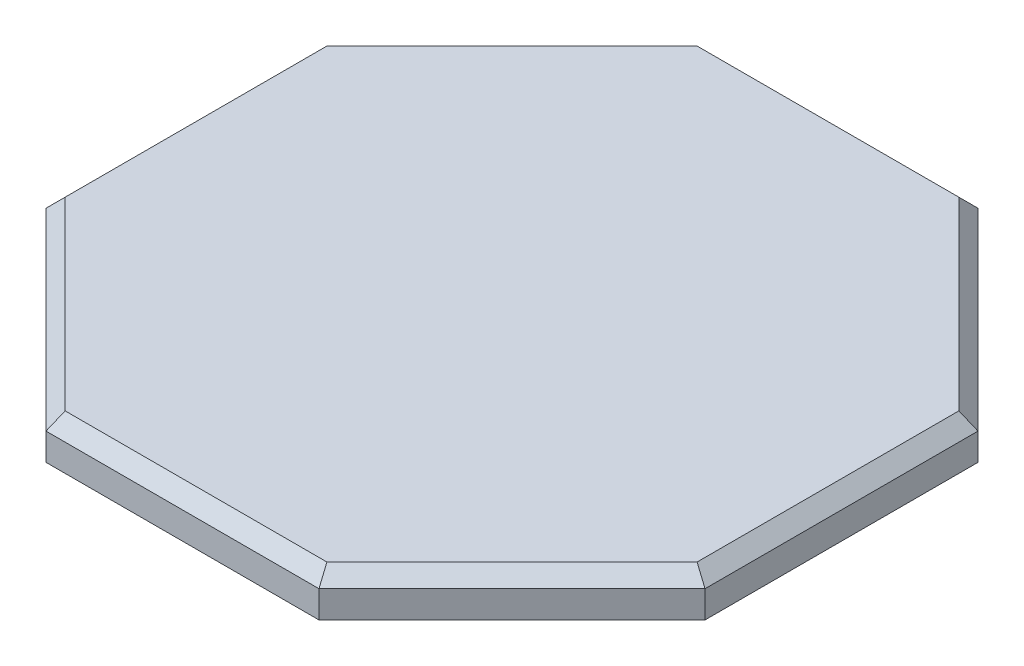
ISO-10303-21;
HEADER;
FILE_DESCRIPTION(('STEP AP214'),'2;1');
FILE_NAME('part.step','',(''),(''),'','','');
FILE_SCHEMA(('AUTOMOTIVE_DESIGN { 1 0 10303 214 1 1 1 1 }'));
ENDSEC;
DATA;
#1=APPLICATION_CONTEXT('core data for automotive mechanical design processes');
#2=APPLICATION_PROTOCOL_DEFINITION('international standard','automotive_design',2000,#1);
#3=PRODUCT_CONTEXT('',#1,'mechanical');
#4=PRODUCT('Part','Part','',(#3));
#5=PRODUCT_RELATED_PRODUCT_CATEGORY('part','',(#4));
#6=PRODUCT_DEFINITION_FORMATION('','',#4);
#7=PRODUCT_DEFINITION_CONTEXT('part definition',#1,'design');
#8=PRODUCT_DEFINITION('design','',#6,#7);
#9=PRODUCT_DEFINITION_SHAPE('','',#8);
#10=(LENGTH_UNIT() NAMED_UNIT(*) SI_UNIT(.MILLI.,.METRE.));
#11=(NAMED_UNIT(*) PLANE_ANGLE_UNIT() SI_UNIT($,.RADIAN.));
#12=(NAMED_UNIT(*) SI_UNIT($,.STERADIAN.) SOLID_ANGLE_UNIT());
#13=UNCERTAINTY_MEASURE_WITH_UNIT(LENGTH_MEASURE(1.E-05),#10,'distance_accuracy_value','');
#14=(GEOMETRIC_REPRESENTATION_CONTEXT(3) GLOBAL_UNCERTAINTY_ASSIGNED_CONTEXT((#13)) GLOBAL_UNIT_ASSIGNED_CONTEXT((#10,
#11,#12)) REPRESENTATION_CONTEXT('',''));
#15=CARTESIAN_POINT('',(0.,0.,0.));
#16=DIRECTION('',(0.,0.,1.));
#17=DIRECTION('',(1.,0.,0.));
#18=AXIS2_PLACEMENT_3D('',#15,#16,#17);
#19=CARTESIAN_POINT('',(-30.2375900532359,9.,73.));
#20=DIRECTION('',(0.,0.,-1.));
#21=DIRECTION('',(-1.,0.,0.));
#22=AXIS2_PLACEMENT_3D('',#19,#20,#21);
#23=PLANE('',#22);
#24=DIRECTION('',(0.,-1.,0.));
#25=VECTOR('',#24,1.);
#26=CARTESIAN_POINT('',(30.2375900532359,9.,73.));
#27=LINE('',#26,#25);
#28=CARTESIAN_POINT('',(30.2375900532359,5.99999999999997,73.));
#29=VERTEX_POINT('',#28);
#30=CARTESIAN_POINT('',(30.2375900532359,0.,73.));
#31=VERTEX_POINT('',#30);
#32=EDGE_CURVE('E291',#29,#31,#27,.T.);
#33=ORIENTED_EDGE('',*,*,#32,.F.);
#34=DIRECTION('',(-1.,0.,0.));
#35=VECTOR('',#34,1.);
#36=CARTESIAN_POINT('',(-30.2375900532359,5.99999999999997,73.));
#37=LINE('',#36,#35);
#38=CARTESIAN_POINT('',(-30.2375900532359,5.99999999999997,73.));
#39=VERTEX_POINT('',#38);
#40=EDGE_CURVE('E11',#29,#39,#37,.T.);
#41=ORIENTED_EDGE('',*,*,#40,.T.);
#42=DIRECTION('',(0.,-1.,0.));
#43=VECTOR('',#42,1.);
#44=CARTESIAN_POINT('',(-30.2375900532359,9.,73.));
#45=LINE('',#44,#43);
#46=CARTESIAN_POINT('',(-30.2375900532359,0.,73.));
#47=VERTEX_POINT('',#46);
#48=EDGE_CURVE('E277',#39,#47,#45,.T.);
#49=ORIENTED_EDGE('',*,*,#48,.T.);
#50=DIRECTION('',(1.,0.,0.));
#51=VECTOR('',#50,1.);
#52=CARTESIAN_POINT('',(-30.2375900532359,0.,73.));
#53=LINE('',#52,#51);
#54=EDGE_CURVE('E207',#47,#31,#53,.T.);
#55=ORIENTED_EDGE('',*,*,#54,.T.);
#56=EDGE_LOOP('',(#33,#41,#49,#55));
#57=FACE_BOUND('',#56,.T.);
#58=ADVANCED_FACE('F43',(#57),#23,.F.);
#59=CARTESIAN_POINT('',(30.2375900532359,9.,73.));
#60=DIRECTION('',(-0.707106781186548,0.,-0.707106781186547));
#61=DIRECTION('',(-0.707106781186547,0.,0.707106781186548));
#62=AXIS2_PLACEMENT_3D('',#59,#60,#61);
#63=PLANE('',#62);
#64=DIRECTION('',(0.,-1.,0.));
#65=VECTOR('',#64,1.);
#66=CARTESIAN_POINT('',(73.,9.,30.2375900532359));
#67=LINE('',#66,#65);
#68=CARTESIAN_POINT('',(73.,5.99999999999997,30.2375900532359));
#69=VERTEX_POINT('',#68);
#70=CARTESIAN_POINT('',(73.,0.,30.2375900532359));
#71=VERTEX_POINT('',#70);
#72=EDGE_CURVE('E289',#69,#71,#67,.T.);
#73=ORIENTED_EDGE('',*,*,#72,.F.);
#74=DIRECTION('',(-0.707106781186547,0.,0.707106781186548));
#75=VECTOR('',#74,1.);
#76=CARTESIAN_POINT('',(30.2375900532359,5.99999999999997,73.));
#77=LINE('',#76,#75);
#78=EDGE_CURVE('E53',#69,#29,#77,.T.);
#79=ORIENTED_EDGE('',*,*,#78,.T.);
#80=ORIENTED_EDGE('',*,*,#32,.T.);
#81=DIRECTION('',(0.707106781186547,0.,-0.707106781186548));
#82=VECTOR('',#81,1.);
#83=CARTESIAN_POINT('',(30.2375900532359,0.,73.));
#84=LINE('',#83,#82);
#85=EDGE_CURVE('E211',#31,#71,#84,.T.);
#86=ORIENTED_EDGE('',*,*,#85,.T.);
#87=EDGE_LOOP('',(#73,#79,#80,#86));
#88=FACE_BOUND('',#87,.T.);
#89=ADVANCED_FACE('F414',(#88),#63,.F.);
#90=CARTESIAN_POINT('',(73.,9.,30.2375900532359));
#91=DIRECTION('',(-1.,0.,0.));
#92=DIRECTION('',(0.,0.,1.));
#93=AXIS2_PLACEMENT_3D('',#90,#91,#92);
#94=PLANE('',#93);
#95=DIRECTION('',(0.,-1.,0.));
#96=VECTOR('',#95,1.);
#97=CARTESIAN_POINT('',(73.,9.,-30.2375900532359));
#98=LINE('',#97,#96);
#99=CARTESIAN_POINT('',(73.,5.99999999999997,-30.2375900532359));
#100=VERTEX_POINT('',#99);
#101=CARTESIAN_POINT('',(73.,0.,-30.2375900532359));
#102=VERTEX_POINT('',#101);
#103=EDGE_CURVE('E287',#100,#102,#98,.T.);
#104=ORIENTED_EDGE('',*,*,#103,.F.);
#105=DIRECTION('',(0.,0.,1.));
#106=VECTOR('',#105,1.);
#107=CARTESIAN_POINT('',(73.,5.99999999999997,30.2375900532359));
#108=LINE('',#107,#106);
#109=EDGE_CURVE('E68',#100,#69,#108,.T.);
#110=ORIENTED_EDGE('',*,*,#109,.T.);
#111=ORIENTED_EDGE('',*,*,#72,.T.);
#112=DIRECTION('',(0.,0.,-1.));
#113=VECTOR('',#112,1.);
#114=CARTESIAN_POINT('',(73.,0.,30.2375900532359));
#115=LINE('',#114,#113);
#116=EDGE_CURVE('E259',#71,#102,#115,.T.);
#117=ORIENTED_EDGE('',*,*,#116,.T.);
#118=EDGE_LOOP('',(#104,#110,#111,#117));
#119=FACE_BOUND('',#118,.T.);
#120=ADVANCED_FACE('F356',(#119),#94,.F.);
#121=CARTESIAN_POINT('',(73.,9.,-30.2375900532359));
#122=DIRECTION('',(-0.707106781186548,0.,0.707106781186547));
#123=DIRECTION('',(0.707106781186547,0.,0.707106781186548));
#124=AXIS2_PLACEMENT_3D('',#121,#122,#123);
#125=PLANE('',#124);
#126=DIRECTION('',(0.,-1.,0.));
#127=VECTOR('',#126,1.);
#128=CARTESIAN_POINT('',(30.2375900532359,9.,-73.));
#129=LINE('',#128,#127);
#130=CARTESIAN_POINT('',(30.2375900532359,5.99999999999997,-73.));
#131=VERTEX_POINT('',#130);
#132=CARTESIAN_POINT('',(30.2375900532359,0.,-73.));
#133=VERTEX_POINT('',#132);
#134=EDGE_CURVE('E285',#131,#133,#129,.T.);
#135=ORIENTED_EDGE('',*,*,#134,.F.);
#136=DIRECTION('',(0.707106781186547,0.,0.707106781186548));
#137=VECTOR('',#136,1.);
#138=CARTESIAN_POINT('',(73.,5.99999999999997,-30.2375900532359));
#139=LINE('',#138,#137);
#140=EDGE_CURVE('E319',#131,#100,#139,.T.);
#141=ORIENTED_EDGE('',*,*,#140,.T.);
#142=ORIENTED_EDGE('',*,*,#103,.T.);
#143=DIRECTION('',(-0.707106781186547,0.,-0.707106781186548));
#144=VECTOR('',#143,1.);
#145=CARTESIAN_POINT('',(73.,0.,-30.2375900532359));
#146=LINE('',#145,#144);
#147=EDGE_CURVE('E262',#102,#133,#146,.T.);
#148=ORIENTED_EDGE('',*,*,#147,.T.);
#149=EDGE_LOOP('',(#135,#141,#142,#148));
#150=FACE_BOUND('',#149,.T.);
#151=ADVANCED_FACE('F355',(#150),#125,.F.);
#152=CARTESIAN_POINT('',(30.2375900532359,9.,-73.));
#153=DIRECTION('',(0.,0.,1.));
#154=DIRECTION('',(1.,0.,0.));
#155=AXIS2_PLACEMENT_3D('',#152,#153,#154);
#156=PLANE('',#155);
#157=DIRECTION('',(0.,-1.,0.));
#158=VECTOR('',#157,1.);
#159=CARTESIAN_POINT('',(-30.2375900532359,9.,-73.));
#160=LINE('',#159,#158);
#161=CARTESIAN_POINT('',(-30.2375900532359,5.99999999999997,-73.));
#162=VERTEX_POINT('',#161);
#163=CARTESIAN_POINT('',(-30.2375900532359,0.,-73.));
#164=VERTEX_POINT('',#163);
#165=EDGE_CURVE('E283',#162,#164,#160,.T.);
#166=ORIENTED_EDGE('',*,*,#165,.F.);
#167=DIRECTION('',(1.,0.,0.));
#168=VECTOR('',#167,1.);
#169=CARTESIAN_POINT('',(30.2375900532359,5.99999999999997,-73.));
#170=LINE('',#169,#168);
#171=EDGE_CURVE('E317',#162,#131,#170,.T.);
#172=ORIENTED_EDGE('',*,*,#171,.T.);
#173=ORIENTED_EDGE('',*,*,#134,.T.);
#174=DIRECTION('',(-1.,0.,0.));
#175=VECTOR('',#174,1.);
#176=CARTESIAN_POINT('',(30.2375900532359,0.,-73.));
#177=LINE('',#176,#175);
#178=EDGE_CURVE('E265',#133,#164,#177,.T.);
#179=ORIENTED_EDGE('',*,*,#178,.T.);
#180=EDGE_LOOP('',(#166,#172,#173,#179));
#181=FACE_BOUND('',#180,.T.);
#182=ADVANCED_FACE('F368',(#181),#156,.F.);
#183=CARTESIAN_POINT('',(-30.2375900532359,9.,-73.));
#184=DIRECTION('',(0.707106781186547,0.,0.707106781186548));
#185=DIRECTION('',(0.707106781186548,0.,-0.707106781186547));
#186=AXIS2_PLACEMENT_3D('',#183,#184,#185);
#187=PLANE('',#186);
#188=DIRECTION('',(0.,-1.,0.));
#189=VECTOR('',#188,1.);
#190=CARTESIAN_POINT('',(-73.,9.,-30.237590053236));
#191=LINE('',#190,#189);
#192=CARTESIAN_POINT('',(-73.,5.99999999999997,-30.237590053236));
#193=VERTEX_POINT('',#192);
#194=CARTESIAN_POINT('',(-73.,0.,-30.237590053236));
#195=VERTEX_POINT('',#194);
#196=EDGE_CURVE('E281',#193,#195,#191,.T.);
#197=ORIENTED_EDGE('',*,*,#196,.F.);
#198=DIRECTION('',(0.707106781186548,0.,-0.707106781186547));
#199=VECTOR('',#198,1.);
#200=CARTESIAN_POINT('',(-30.2375900532359,5.99999999999997,-73.));
#201=LINE('',#200,#199);
#202=EDGE_CURVE('E315',#193,#162,#201,.T.);
#203=ORIENTED_EDGE('',*,*,#202,.T.);
#204=ORIENTED_EDGE('',*,*,#165,.T.);
#205=DIRECTION('',(-0.707106781186548,0.,0.707106781186547));
#206=VECTOR('',#205,1.);
#207=CARTESIAN_POINT('',(-30.2375900532359,0.,-73.));
#208=LINE('',#207,#206);
#209=EDGE_CURVE('E268',#164,#195,#208,.T.);
#210=ORIENTED_EDGE('',*,*,#209,.T.);
#211=EDGE_LOOP('',(#197,#203,#204,#210));
#212=FACE_BOUND('',#211,.T.);
#213=ADVANCED_FACE('F371',(#212),#187,.F.);
#214=CARTESIAN_POINT('',(-73.,9.,-30.237590053236));
#215=DIRECTION('',(1.,0.,0.));
#216=DIRECTION('',(0.,0.,-1.));
#217=AXIS2_PLACEMENT_3D('',#214,#215,#216);
#218=PLANE('',#217);
#219=DIRECTION('',(0.,-1.,0.));
#220=VECTOR('',#219,1.);
#221=CARTESIAN_POINT('',(-73.,9.,30.2375900532359));
#222=LINE('',#221,#220);
#223=CARTESIAN_POINT('',(-73.,5.99999999999997,30.2375900532359));
#224=VERTEX_POINT('',#223);
#225=CARTESIAN_POINT('',(-73.,0.,30.2375900532359));
#226=VERTEX_POINT('',#225);
#227=EDGE_CURVE('E279',#224,#226,#222,.T.);
#228=ORIENTED_EDGE('',*,*,#227,.F.);
#229=DIRECTION('',(0.,0.,-1.));
#230=VECTOR('',#229,1.);
#231=CARTESIAN_POINT('',(-73.,5.99999999999997,-30.237590053236));
#232=LINE('',#231,#230);
#233=EDGE_CURVE('E313',#224,#193,#232,.T.);
#234=ORIENTED_EDGE('',*,*,#233,.T.);
#235=ORIENTED_EDGE('',*,*,#196,.T.);
#236=DIRECTION('',(0.,0.,1.));
#237=VECTOR('',#236,1.);
#238=CARTESIAN_POINT('',(-73.,0.,-30.237590053236));
#239=LINE('',#238,#237);
#240=EDGE_CURVE('E271',#195,#226,#239,.T.);
#241=ORIENTED_EDGE('',*,*,#240,.T.);
#242=EDGE_LOOP('',(#228,#234,#235,#241));
#243=FACE_BOUND('',#242,.T.);
#244=ADVANCED_FACE('F428',(#243),#218,.F.);
#245=CARTESIAN_POINT('',(-73.,9.,30.2375900532359));
#246=DIRECTION('',(0.707106781186548,0.,-0.707106781186547));
#247=DIRECTION('',(-0.707106781186547,0.,-0.707106781186548));
#248=AXIS2_PLACEMENT_3D('',#245,#246,#247);
#249=PLANE('',#248);
#250=ORIENTED_EDGE('',*,*,#48,.F.);
#251=DIRECTION('',(-0.707106781186547,0.,-0.707106781186548));
#252=VECTOR('',#251,1.);
#253=CARTESIAN_POINT('',(-73.,5.99999999999997,30.2375900532359));
#254=LINE('',#253,#252);
#255=EDGE_CURVE('E310',#39,#224,#254,.T.);
#256=ORIENTED_EDGE('',*,*,#255,.T.);
#257=ORIENTED_EDGE('',*,*,#227,.T.);
#258=DIRECTION('',(0.707106781186547,0.,0.707106781186548));
#259=VECTOR('',#258,1.);
#260=CARTESIAN_POINT('',(-73.,0.,30.2375900532359));
#261=LINE('',#260,#259);
#262=EDGE_CURVE('E274',#226,#47,#261,.T.);
#263=ORIENTED_EDGE('',*,*,#262,.T.);
#264=EDGE_LOOP('',(#250,#256,#257,#263));
#265=FACE_BOUND('',#264,.T.);
#266=ADVANCED_FACE('F400',(#265),#249,.F.);
#267=CARTESIAN_POINT('',(0.,9.,0.));
#268=DIRECTION('',(0.,1.,0.));
#269=DIRECTION('',(0.,0.,1.));
#270=AXIS2_PLACEMENT_3D('',#267,#268,#269);
#271=PLANE('',#270);
#272=DIRECTION('',(0.,0.,1.));
#273=VECTOR('',#272,1.);
#274=CARTESIAN_POINT('',(-70.,9.,30.2375900532359));
#275=LINE('',#274,#273);
#276=CARTESIAN_POINT('',(-70.,9.,-28.9949493661167));
#277=VERTEX_POINT('',#276);
#278=CARTESIAN_POINT('',(-70.,9.,28.9949493661166));
#279=VERTEX_POINT('',#278);
#280=EDGE_CURVE('E305',#277,#279,#275,.T.);
#281=ORIENTED_EDGE('',*,*,#280,.T.);
#282=DIRECTION('',(0.707106781186547,0.,0.707106781186548));
#283=VECTOR('',#282,1.);
#284=CARTESIAN_POINT('',(-28.1162697096763,9.,70.8786796564404));
#285=LINE('',#284,#283);
#286=CARTESIAN_POINT('',(-28.9949493661166,9.,70.));
#287=VERTEX_POINT('',#286);
#288=EDGE_CURVE('E307',#279,#287,#285,.T.);
#289=ORIENTED_EDGE('',*,*,#288,.T.);
#290=DIRECTION('',(1.,0.,0.));
#291=VECTOR('',#290,1.);
#292=CARTESIAN_POINT('',(30.2375900532359,9.,70.));
#293=LINE('',#292,#291);
#294=CARTESIAN_POINT('',(28.9949493661166,9.,70.));
#295=VERTEX_POINT('',#294);
#296=EDGE_CURVE('E293',#287,#295,#293,.T.);
#297=ORIENTED_EDGE('',*,*,#296,.T.);
#298=DIRECTION('',(0.707106781186547,0.,-0.707106781186548));
#299=VECTOR('',#298,1.);
#300=CARTESIAN_POINT('',(70.8786796564404,9.,28.1162697096763));
#301=LINE('',#300,#299);
#302=CARTESIAN_POINT('',(70.,9.,28.9949493661166));
#303=VERTEX_POINT('',#302);
#304=EDGE_CURVE('E295',#295,#303,#301,.T.);
#305=ORIENTED_EDGE('',*,*,#304,.T.);
#306=DIRECTION('',(0.,0.,-1.));
#307=VECTOR('',#306,1.);
#308=CARTESIAN_POINT('',(70.,9.,-30.2375900532359));
#309=LINE('',#308,#307);
#310=CARTESIAN_POINT('',(70.,9.,-28.9949493661166));
#311=VERTEX_POINT('',#310);
#312=EDGE_CURVE('E297',#303,#311,#309,.T.);
#313=ORIENTED_EDGE('',*,*,#312,.T.);
#314=DIRECTION('',(-0.707106781186547,0.,-0.707106781186548));
#315=VECTOR('',#314,1.);
#316=CARTESIAN_POINT('',(28.1162697096763,9.,-70.8786796564404));
#317=LINE('',#316,#315);
#318=CARTESIAN_POINT('',(28.9949493661166,9.,-70.));
#319=VERTEX_POINT('',#318);
#320=EDGE_CURVE('E299',#311,#319,#317,.T.);
#321=ORIENTED_EDGE('',*,*,#320,.T.);
#322=DIRECTION('',(-1.,0.,0.));
#323=VECTOR('',#322,1.);
#324=CARTESIAN_POINT('',(-30.2375900532359,9.,-70.));
#325=LINE('',#324,#323);
#326=CARTESIAN_POINT('',(-28.9949493661166,9.,-70.));
#327=VERTEX_POINT('',#326);
#328=EDGE_CURVE('E301',#319,#327,#325,.T.);
#329=ORIENTED_EDGE('',*,*,#328,.T.);
#330=DIRECTION('',(-0.707106781186548,0.,0.707106781186547));
#331=VECTOR('',#330,1.);
#332=CARTESIAN_POINT('',(-70.8786796564403,9.,-28.1162697096763));
#333=LINE('',#332,#331);
#334=EDGE_CURVE('E303',#327,#277,#333,.T.);
#335=ORIENTED_EDGE('',*,*,#334,.T.);
#336=EDGE_LOOP('',(#281,#289,#297,#305,#313,#321,#329,#335));
#337=FACE_BOUND('',#336,.T.);
#338=ADVANCED_FACE('F384',(#337),#271,.T.);
#339=CARTESIAN_POINT('',(0.,0.,0.));
#340=DIRECTION('',(0.,1.,0.));
#341=DIRECTION('',(0.,0.,1.));
#342=AXIS2_PLACEMENT_3D('',#339,#340,#341);
#343=PLANE('',#342);
#344=DIRECTION('',(0.707106781186547,0.,0.707106781186548));
#345=VECTOR('',#344,1.);
#346=CARTESIAN_POINT('',(-70.8786796564403,0.,28.1162697096763));
#347=LINE('',#346,#345);
#348=CARTESIAN_POINT('',(-70.,0.,28.9949493661166));
#349=VERTEX_POINT('',#348);
#350=CARTESIAN_POINT('',(-28.9949493661167,0.,70.));
#351=VERTEX_POINT('',#350);
#352=EDGE_CURVE('E202',#349,#351,#347,.T.);
#353=ORIENTED_EDGE('',*,*,#352,.T.);
#354=DIRECTION('',(1.,0.,0.));
#355=VECTOR('',#354,1.);
#356=CARTESIAN_POINT('',(-30.2375900532359,0.,70.));
#357=LINE('',#356,#355);
#358=CARTESIAN_POINT('',(28.9949493661167,0.,70.));
#359=VERTEX_POINT('',#358);
#360=EDGE_CURVE('E237',#351,#359,#357,.T.);
#361=ORIENTED_EDGE('',*,*,#360,.T.);
#362=DIRECTION('',(0.707106781186547,0.,-0.707106781186548));
#363=VECTOR('',#362,1.);
#364=CARTESIAN_POINT('',(28.1162697096763,0.,70.8786796564404));
#365=LINE('',#364,#363);
#366=CARTESIAN_POINT('',(70.,0.,28.9949493661167));
#367=VERTEX_POINT('',#366);
#368=EDGE_CURVE('E206',#359,#367,#365,.T.);
#369=ORIENTED_EDGE('',*,*,#368,.T.);
#370=DIRECTION('',(0.,0.,-1.));
#371=VECTOR('',#370,1.);
#372=CARTESIAN_POINT('',(70.,0.,30.2375900532359));
#373=LINE('',#372,#371);
#374=CARTESIAN_POINT('',(70.,0.,-28.9949493661166));
#375=VERTEX_POINT('',#374);
#376=EDGE_CURVE('E253',#367,#375,#373,.T.);
#377=ORIENTED_EDGE('',*,*,#376,.T.);
#378=DIRECTION('',(-0.707106781186547,0.,-0.707106781186548));
#379=VECTOR('',#378,1.);
#380=CARTESIAN_POINT('',(70.8786796564403,0.,-28.1162697096763));
#381=LINE('',#380,#379);
#382=CARTESIAN_POINT('',(28.9949493661166,0.,-70.));
#383=VERTEX_POINT('',#382);
#384=EDGE_CURVE('E250',#375,#383,#381,.T.);
#385=ORIENTED_EDGE('',*,*,#384,.T.);
#386=DIRECTION('',(-1.,0.,0.));
#387=VECTOR('',#386,1.);
#388=CARTESIAN_POINT('',(30.2375900532359,0.,-70.));
#389=LINE('',#388,#387);
#390=CARTESIAN_POINT('',(-28.9949493661166,0.,-70.));
#391=VERTEX_POINT('',#390);
#392=EDGE_CURVE('E247',#383,#391,#389,.T.);
#393=ORIENTED_EDGE('',*,*,#392,.T.);
#394=DIRECTION('',(-0.707106781186548,0.,0.707106781186547));
#395=VECTOR('',#394,1.);
#396=CARTESIAN_POINT('',(-28.1162697096763,0.,-70.8786796564404));
#397=LINE('',#396,#395);
#398=CARTESIAN_POINT('',(-70.,0.,-28.9949493661167));
#399=VERTEX_POINT('',#398);
#400=EDGE_CURVE('E244',#391,#399,#397,.T.);
#401=ORIENTED_EDGE('',*,*,#400,.T.);
#402=DIRECTION('',(0.,0.,1.));
#403=VECTOR('',#402,1.);
#404=CARTESIAN_POINT('',(-70.,0.,-30.237590053236));
#405=LINE('',#404,#403);
#406=EDGE_CURVE('E241',#399,#349,#405,.T.);
#407=ORIENTED_EDGE('',*,*,#406,.T.);
#408=EDGE_LOOP('',(#353,#361,#369,#377,#385,#393,#401,#407));
#409=FACE_BOUND('',#408,.T.);
#410=ORIENTED_EDGE('',*,*,#54,.F.);
#411=ORIENTED_EDGE('',*,*,#262,.F.);
#412=ORIENTED_EDGE('',*,*,#240,.F.);
#413=ORIENTED_EDGE('',*,*,#209,.F.);
#414=ORIENTED_EDGE('',*,*,#178,.F.);
#415=ORIENTED_EDGE('',*,*,#147,.F.);
#416=ORIENTED_EDGE('',*,*,#116,.F.);
#417=ORIENTED_EDGE('',*,*,#85,.F.);
#418=EDGE_LOOP('',(#410,#411,#412,#413,#414,#415,#416,#417));
#419=FACE_BOUND('',#418,.T.);
#420=ADVANCED_FACE('F363',(#409,#419),#343,.F.);
#421=CARTESIAN_POINT('',(-30.2375900532359,9.,70.));
#422=DIRECTION('',(0.,0.,-1.));
#423=DIRECTION('',(-1.,0.,0.));
#424=AXIS2_PLACEMENT_3D('',#421,#422,#423);
#425=PLANE('',#424);
#426=ORIENTED_EDGE('',*,*,#360,.F.);
#427=DIRECTION('',(0.,-1.,0.));
#428=VECTOR('',#427,1.);
#429=CARTESIAN_POINT('',(-28.9949493661167,9.,70.));
#430=LINE('',#429,#428);
#431=CARTESIAN_POINT('',(-28.9949493661167,6.,70.));
#432=VERTEX_POINT('',#431);
#433=EDGE_CURVE('E201',#432,#351,#430,.T.);
#434=ORIENTED_EDGE('',*,*,#433,.F.);
#435=DIRECTION('',(1.,0.,0.));
#436=VECTOR('',#435,1.);
#437=CARTESIAN_POINT('',(-30.2375900532359,6.,70.));
#438=LINE('',#437,#436);
#439=CARTESIAN_POINT('',(28.9949493661167,6.,70.));
#440=VERTEX_POINT('',#439);
#441=EDGE_CURVE('E186',#432,#440,#438,.T.);
#442=ORIENTED_EDGE('',*,*,#441,.T.);
#443=DIRECTION('',(0.,-1.,0.));
#444=VECTOR('',#443,1.);
#445=CARTESIAN_POINT('',(28.9949493661167,9.,70.));
#446=LINE('',#445,#444);
#447=EDGE_CURVE('E199',#440,#359,#446,.T.);
#448=ORIENTED_EDGE('',*,*,#447,.T.);
#449=EDGE_LOOP('',(#426,#434,#442,#448));
#450=FACE_BOUND('',#449,.T.);
#451=ADVANCED_FACE('F198',(#450),#425,.T.);
#452=CARTESIAN_POINT('',(28.1162697096763,9.,70.8786796564404));
#453=DIRECTION('',(-0.707106781186548,0.,-0.707106781186547));
#454=DIRECTION('',(-0.707106781186547,0.,0.707106781186548));
#455=AXIS2_PLACEMENT_3D('',#452,#453,#454);
#456=PLANE('',#455);
#457=ORIENTED_EDGE('',*,*,#368,.F.);
#458=ORIENTED_EDGE('',*,*,#447,.F.);
#459=DIRECTION('',(0.707106781186547,0.,-0.707106781186548));
#460=VECTOR('',#459,1.);
#461=CARTESIAN_POINT('',(28.1162697096763,6.,70.8786796564404));
#462=LINE('',#461,#460);
#463=CARTESIAN_POINT('',(70.,6.,28.9949493661167));
#464=VERTEX_POINT('',#463);
#465=EDGE_CURVE('E182',#440,#464,#462,.T.);
#466=ORIENTED_EDGE('',*,*,#465,.T.);
#467=DIRECTION('',(0.,-1.,0.));
#468=VECTOR('',#467,1.);
#469=CARTESIAN_POINT('',(70.,9.,28.9949493661167));
#470=LINE('',#469,#468);
#471=EDGE_CURVE('E208',#464,#367,#470,.T.);
#472=ORIENTED_EDGE('',*,*,#471,.T.);
#473=EDGE_LOOP('',(#457,#458,#466,#472));
#474=FACE_BOUND('',#473,.T.);
#475=ADVANCED_FACE('F204',(#474),#456,.T.);
#476=CARTESIAN_POINT('',(70.,9.,30.2375900532359));
#477=DIRECTION('',(-1.,0.,0.));
#478=DIRECTION('',(0.,0.,1.));
#479=AXIS2_PLACEMENT_3D('',#476,#477,#478);
#480=PLANE('',#479);
#481=ORIENTED_EDGE('',*,*,#376,.F.);
#482=ORIENTED_EDGE('',*,*,#471,.F.);
#483=DIRECTION('',(0.,0.,-1.));
#484=VECTOR('',#483,1.);
#485=CARTESIAN_POINT('',(70.,6.,30.2375900532359));
#486=LINE('',#485,#484);
#487=CARTESIAN_POINT('',(70.,6.,-28.9949493661166));
#488=VERTEX_POINT('',#487);
#489=EDGE_CURVE('E188',#464,#488,#486,.T.);
#490=ORIENTED_EDGE('',*,*,#489,.T.);
#491=DIRECTION('',(0.,-1.,0.));
#492=VECTOR('',#491,1.);
#493=CARTESIAN_POINT('',(70.,9.,-28.9949493661166));
#494=LINE('',#493,#492);
#495=EDGE_CURVE('E213',#488,#375,#494,.T.);
#496=ORIENTED_EDGE('',*,*,#495,.T.);
#497=EDGE_LOOP('',(#481,#482,#490,#496));
#498=FACE_BOUND('',#497,.T.);
#499=ADVANCED_FACE('F460',(#498),#480,.T.);
#500=CARTESIAN_POINT('',(70.8786796564403,9.,-28.1162697096763));
#501=DIRECTION('',(-0.707106781186548,0.,0.707106781186547));
#502=DIRECTION('',(0.707106781186547,0.,0.707106781186548));
#503=AXIS2_PLACEMENT_3D('',#500,#501,#502);
#504=PLANE('',#503);
#505=ORIENTED_EDGE('',*,*,#384,.F.);
#506=ORIENTED_EDGE('',*,*,#495,.F.);
#507=DIRECTION('',(-0.707106781186547,0.,-0.707106781186548));
#508=VECTOR('',#507,1.);
#509=CARTESIAN_POINT('',(70.8786796564403,6.,-28.1162697096763));
#510=LINE('',#509,#508);
#511=CARTESIAN_POINT('',(28.9949493661166,6.,-70.));
#512=VERTEX_POINT('',#511);
#513=EDGE_CURVE('E222',#488,#512,#510,.T.);
#514=ORIENTED_EDGE('',*,*,#513,.T.);
#515=DIRECTION('',(0.,-1.,0.));
#516=VECTOR('',#515,1.);
#517=CARTESIAN_POINT('',(28.9949493661166,9.,-70.));
#518=LINE('',#517,#516);
#519=EDGE_CURVE('E220',#512,#383,#518,.T.);
#520=ORIENTED_EDGE('',*,*,#519,.T.);
#521=EDGE_LOOP('',(#505,#506,#514,#520));
#522=FACE_BOUND('',#521,.T.);
#523=ADVANCED_FACE('F456',(#522),#504,.T.);
#524=CARTESIAN_POINT('',(30.2375900532359,9.,-70.));
#525=DIRECTION('',(0.,0.,1.));
#526=DIRECTION('',(1.,0.,0.));
#527=AXIS2_PLACEMENT_3D('',#524,#525,#526);
#528=PLANE('',#527);
#529=ORIENTED_EDGE('',*,*,#392,.F.);
#530=ORIENTED_EDGE('',*,*,#519,.F.);
#531=DIRECTION('',(-1.,0.,0.));
#532=VECTOR('',#531,1.);
#533=CARTESIAN_POINT('',(30.2375900532359,6.,-70.));
#534=LINE('',#533,#532);
#535=CARTESIAN_POINT('',(-28.9949493661166,6.,-70.));
#536=VERTEX_POINT('',#535);
#537=EDGE_CURVE('E226',#512,#536,#534,.T.);
#538=ORIENTED_EDGE('',*,*,#537,.T.);
#539=DIRECTION('',(0.,-1.,0.));
#540=VECTOR('',#539,1.);
#541=CARTESIAN_POINT('',(-28.9949493661166,9.,-70.));
#542=LINE('',#541,#540);
#543=EDGE_CURVE('E224',#536,#391,#542,.T.);
#544=ORIENTED_EDGE('',*,*,#543,.T.);
#545=EDGE_LOOP('',(#529,#530,#538,#544));
#546=FACE_BOUND('',#545,.T.);
#547=ADVANCED_FACE('F452',(#546),#528,.T.);
#548=CARTESIAN_POINT('',(-28.1162697096763,9.,-70.8786796564404));
#549=DIRECTION('',(0.707106781186547,0.,0.707106781186548));
#550=DIRECTION('',(0.707106781186548,0.,-0.707106781186547));
#551=AXIS2_PLACEMENT_3D('',#548,#549,#550);
#552=PLANE('',#551);
#553=ORIENTED_EDGE('',*,*,#400,.F.);
#554=ORIENTED_EDGE('',*,*,#543,.F.);
#555=DIRECTION('',(-0.707106781186548,0.,0.707106781186547));
#556=VECTOR('',#555,1.);
#557=CARTESIAN_POINT('',(-28.1162697096763,6.,-70.8786796564404));
#558=LINE('',#557,#556);
#559=CARTESIAN_POINT('',(-70.,6.,-28.9949493661167));
#560=VERTEX_POINT('',#559);
#561=EDGE_CURVE('E230',#536,#560,#558,.T.);
#562=ORIENTED_EDGE('',*,*,#561,.T.);
#563=DIRECTION('',(0.,-1.,0.));
#564=VECTOR('',#563,1.);
#565=CARTESIAN_POINT('',(-70.,9.,-28.9949493661167));
#566=LINE('',#565,#564);
#567=EDGE_CURVE('E228',#560,#399,#566,.T.);
#568=ORIENTED_EDGE('',*,*,#567,.T.);
#569=EDGE_LOOP('',(#553,#554,#562,#568));
#570=FACE_BOUND('',#569,.T.);
#571=ADVANCED_FACE('F448',(#570),#552,.T.);
#572=CARTESIAN_POINT('',(-70.,9.,-30.237590053236));
#573=DIRECTION('',(1.,0.,0.));
#574=DIRECTION('',(0.,0.,-1.));
#575=AXIS2_PLACEMENT_3D('',#572,#573,#574);
#576=PLANE('',#575);
#577=ORIENTED_EDGE('',*,*,#406,.F.);
#578=ORIENTED_EDGE('',*,*,#567,.F.);
#579=DIRECTION('',(0.,0.,1.));
#580=VECTOR('',#579,1.);
#581=CARTESIAN_POINT('',(-70.,6.,-30.237590053236));
#582=LINE('',#581,#580);
#583=CARTESIAN_POINT('',(-70.,6.,28.9949493661166));
#584=VERTEX_POINT('',#583);
#585=EDGE_CURVE('E233',#560,#584,#582,.T.);
#586=ORIENTED_EDGE('',*,*,#585,.T.);
#587=DIRECTION('',(0.,-1.,0.));
#588=VECTOR('',#587,1.);
#589=CARTESIAN_POINT('',(-70.,9.,28.9949493661166));
#590=LINE('',#589,#588);
#591=EDGE_CURVE('E216',#584,#349,#590,.T.);
#592=ORIENTED_EDGE('',*,*,#591,.T.);
#593=EDGE_LOOP('',(#577,#578,#586,#592));
#594=FACE_BOUND('',#593,.T.);
#595=ADVANCED_FACE('F444',(#594),#576,.T.);
#596=CARTESIAN_POINT('',(-70.8786796564403,9.,28.1162697096763));
#597=DIRECTION('',(0.707106781186548,0.,-0.707106781186547));
#598=DIRECTION('',(-0.707106781186547,0.,-0.707106781186548));
#599=AXIS2_PLACEMENT_3D('',#596,#597,#598);
#600=PLANE('',#599);
#601=ORIENTED_EDGE('',*,*,#352,.F.);
#602=ORIENTED_EDGE('',*,*,#591,.F.);
#603=DIRECTION('',(0.707106781186547,0.,0.707106781186548));
#604=VECTOR('',#603,1.);
#605=CARTESIAN_POINT('',(-70.8786796564403,6.,28.1162697096763));
#606=LINE('',#605,#604);
#607=EDGE_CURVE('E217',#584,#432,#606,.T.);
#608=ORIENTED_EDGE('',*,*,#607,.T.);
#609=ORIENTED_EDGE('',*,*,#433,.T.);
#610=EDGE_LOOP('',(#601,#602,#608,#609));
#611=FACE_BOUND('',#610,.T.);
#612=ADVANCED_FACE('F441',(#611),#600,.T.);
#613=CARTESIAN_POINT('',(0.,6.,0.));
#614=DIRECTION('',(0.,1.,0.));
#615=DIRECTION('',(0.,0.,1.));
#616=AXIS2_PLACEMENT_3D('',#613,#614,#615);
#617=PLANE('',#616);
#618=ORIENTED_EDGE('',*,*,#441,.F.);
#619=ORIENTED_EDGE('',*,*,#607,.F.);
#620=ORIENTED_EDGE('',*,*,#585,.F.);
#621=ORIENTED_EDGE('',*,*,#561,.F.);
#622=ORIENTED_EDGE('',*,*,#537,.F.);
#623=ORIENTED_EDGE('',*,*,#513,.F.);
#624=ORIENTED_EDGE('',*,*,#489,.F.);
#625=ORIENTED_EDGE('',*,*,#465,.F.);
#626=EDGE_LOOP('',(#618,#619,#620,#621,#622,#623,#624,#625));
#627=FACE_BOUND('',#626,.T.);
#628=ADVANCED_FACE('F184',(#627),#617,.F.);
#629=CARTESIAN_POINT('',(49.4974746830583,9.,-49.4974746830583));
#630=DIRECTION('',(0.500000000000002,0.707106781186545,-0.500000000000002));
#631=DIRECTION('',(0.707106781186547,0.,0.707106781186548));
#632=AXIS2_PLACEMENT_3D('',#629,#630,#631);
#633=PLANE('',#632);
#634=DIRECTION('',(-0.678598344545844,0.67859834454585,0.281084637714822));
#635=VECTOR('',#634,1.);
#636=CARTESIAN_POINT('',(64.469399850851,14.5306001491491,-26.7040997762764));
#637=LINE('',#636,#635);
#638=EDGE_CURVE('E338',#100,#311,#637,.T.);
#639=ORIENTED_EDGE('',*,*,#638,.F.);
#640=ORIENTED_EDGE('',*,*,#140,.F.);
#641=DIRECTION('',(-0.281084637714822,0.67859834454585,0.678598344545844));
#642=VECTOR('',#641,1.);
#643=CARTESIAN_POINT('',(26.7040997762764,14.530600149149,-64.4693998508511));
#644=LINE('',#643,#642);
#645=EDGE_CURVE('E48',#319,#131,#644,.F.);
#646=ORIENTED_EDGE('',*,*,#645,.F.);
#647=ORIENTED_EDGE('',*,*,#320,.F.);
#648=EDGE_LOOP('',(#639,#640,#646,#647));
#649=FACE_BOUND('',#648,.T.);
#650=ADVANCED_FACE('F46',(#649),#633,.T.);
#651=CARTESIAN_POINT('',(0.,9.,-70.));
#652=DIRECTION('',(0.,0.707106781186544,-0.707106781186551));
#653=DIRECTION('',(1.,0.,0.));
#654=AXIS2_PLACEMENT_3D('',#651,#652,#653);
#655=PLANE('',#654);
#656=ORIENTED_EDGE('',*,*,#645,.T.);
#657=ORIENTED_EDGE('',*,*,#171,.F.);
#658=DIRECTION('',(0.281084637714819,0.67859834454585,0.678598344545844));
#659=VECTOR('',#658,1.);
#660=CARTESIAN_POINT('',(-26.7040997762765,14.530600149149,-64.469399850851));
#661=LINE('',#660,#659);
#662=EDGE_CURVE('E336',#327,#162,#661,.F.);
#663=ORIENTED_EDGE('',*,*,#662,.F.);
#664=ORIENTED_EDGE('',*,*,#328,.F.);
#665=EDGE_LOOP('',(#656,#657,#663,#664));
#666=FACE_BOUND('',#665,.T.);
#667=ADVANCED_FACE('F348',(#666),#655,.T.);
#668=CARTESIAN_POINT('',(70.,9.,0.));
#669=DIRECTION('',(0.707106781186551,0.707106781186544,0.));
#670=DIRECTION('',(0.,0.,1.));
#671=AXIS2_PLACEMENT_3D('',#668,#669,#670);
#672=PLANE('',#671);
#673=ORIENTED_EDGE('',*,*,#638,.T.);
#674=ORIENTED_EDGE('',*,*,#312,.F.);
#675=DIRECTION('',(-0.678598344545843,0.67859834454585,-0.281084637714823));
#676=VECTOR('',#675,1.);
#677=CARTESIAN_POINT('',(64.4693998508511,14.530600149149,26.7040997762765));
#678=LINE('',#677,#676);
#679=EDGE_CURVE('E333',#69,#303,#678,.T.);
#680=ORIENTED_EDGE('',*,*,#679,.F.);
#681=ORIENTED_EDGE('',*,*,#109,.F.);
#682=EDGE_LOOP('',(#673,#674,#680,#681));
#683=FACE_BOUND('',#682,.T.);
#684=ADVANCED_FACE('F387',(#683),#672,.T.);
#685=CARTESIAN_POINT('',(-49.4974746830583,9.,-49.4974746830583));
#686=DIRECTION('',(-0.500000000000002,0.707106781186544,-0.500000000000002));
#687=DIRECTION('',(0.707106781186548,0.,-0.707106781186547));
#688=AXIS2_PLACEMENT_3D('',#685,#686,#687);
#689=PLANE('',#688);
#690=ORIENTED_EDGE('',*,*,#662,.T.);
#691=ORIENTED_EDGE('',*,*,#202,.F.);
#692=DIRECTION('',(0.678598344545844,0.67859834454585,0.281084637714819));
#693=VECTOR('',#692,1.);
#694=CARTESIAN_POINT('',(-64.469399850851,14.530600149149,-26.7040997762765));
#695=LINE('',#694,#693);
#696=EDGE_CURVE('E330',#277,#193,#695,.F.);
#697=ORIENTED_EDGE('',*,*,#696,.F.);
#698=ORIENTED_EDGE('',*,*,#334,.F.);
#699=EDGE_LOOP('',(#690,#691,#697,#698));
#700=FACE_BOUND('',#699,.T.);
#701=ADVANCED_FACE('F375',(#700),#689,.T.);
#702=CARTESIAN_POINT('',(49.4974746830583,9.,49.4974746830583));
#703=DIRECTION('',(0.500000000000001,0.707106781186546,0.500000000000001));
#704=DIRECTION('',(-0.707106781186547,0.,0.707106781186548));
#705=AXIS2_PLACEMENT_3D('',#702,#703,#704);
#706=PLANE('',#705);
#707=ORIENTED_EDGE('',*,*,#679,.T.);
#708=ORIENTED_EDGE('',*,*,#304,.F.);
#709=DIRECTION('',(-0.281084637714823,0.67859834454585,-0.678598344545843));
#710=VECTOR('',#709,1.);
#711=CARTESIAN_POINT('',(26.7040997762764,14.5306001491491,64.469399850851));
#712=LINE('',#711,#710);
#713=EDGE_CURVE('E327',#29,#295,#712,.T.);
#714=ORIENTED_EDGE('',*,*,#713,.F.);
#715=ORIENTED_EDGE('',*,*,#78,.F.);
#716=EDGE_LOOP('',(#707,#708,#714,#715));
#717=FACE_BOUND('',#716,.T.);
#718=ADVANCED_FACE('F389',(#717),#706,.T.);
#719=CARTESIAN_POINT('',(-70.,9.,0.));
#720=DIRECTION('',(-0.707106781186551,0.707106781186544,0.));
#721=DIRECTION('',(0.,0.,-1.));
#722=AXIS2_PLACEMENT_3D('',#719,#720,#721);
#723=PLANE('',#722);
#724=ORIENTED_EDGE('',*,*,#696,.T.);
#725=ORIENTED_EDGE('',*,*,#233,.F.);
#726=DIRECTION('',(0.678598344545844,0.67859834454585,-0.28108463771482));
#727=VECTOR('',#726,1.);
#728=CARTESIAN_POINT('',(-64.469399850851,14.530600149149,26.7040997762764));
#729=LINE('',#728,#727);
#730=EDGE_CURVE('E325',#279,#224,#729,.F.);
#731=ORIENTED_EDGE('',*,*,#730,.F.);
#732=ORIENTED_EDGE('',*,*,#280,.F.);
#733=EDGE_LOOP('',(#724,#725,#731,#732));
#734=FACE_BOUND('',#733,.T.);
#735=ADVANCED_FACE('F380',(#734),#723,.T.);
#736=CARTESIAN_POINT('',(0.,9.,70.));
#737=DIRECTION('',(0.,0.707106781186544,0.707106781186551));
#738=DIRECTION('',(-1.,0.,0.));
#739=AXIS2_PLACEMENT_3D('',#736,#737,#738);
#740=PLANE('',#739);
#741=ORIENTED_EDGE('',*,*,#713,.T.);
#742=ORIENTED_EDGE('',*,*,#296,.F.);
#743=DIRECTION('',(-0.281084637714821,-0.67859834454585,0.678598344545844));
#744=VECTOR('',#743,1.);
#745=CARTESIAN_POINT('',(-26.7040997762765,14.5306001491491,64.469399850851));
#746=LINE('',#745,#744);
#747=EDGE_CURVE('E323',#39,#287,#746,.F.);
#748=ORIENTED_EDGE('',*,*,#747,.F.);
#749=ORIENTED_EDGE('',*,*,#40,.F.);
#750=EDGE_LOOP('',(#741,#742,#748,#749));
#751=FACE_BOUND('',#750,.T.);
#752=ADVANCED_FACE('F395',(#751),#740,.T.);
#753=CARTESIAN_POINT('',(-49.4974746830583,9.,49.4974746830583));
#754=DIRECTION('',(-0.500000000000002,0.707106781186545,0.500000000000002));
#755=DIRECTION('',(-0.707106781186547,0.,-0.707106781186548));
#756=AXIS2_PLACEMENT_3D('',#753,#754,#755);
#757=PLANE('',#756);
#758=ORIENTED_EDGE('',*,*,#730,.T.);
#759=ORIENTED_EDGE('',*,*,#255,.F.);
#760=ORIENTED_EDGE('',*,*,#747,.T.);
#761=ORIENTED_EDGE('',*,*,#288,.F.);
#762=EDGE_LOOP('',(#758,#759,#760,#761));
#763=FACE_BOUND('',#762,.T.);
#764=ADVANCED_FACE('F404',(#763),#757,.T.);
#765=CLOSED_SHELL('',(#58,#89,#120,#151,#182,#213,#244,#266,#338,#420,#451,#475,#499,#523,#547,
#571,#595,#612,#628,#650,#667,#684,#701,#718,#735,#752,#764));
#766=MANIFOLD_SOLID_BREP('B2',#765);
#767=ADVANCED_BREP_SHAPE_REPRESENTATION('',(#18,#766),#14);
#768=SHAPE_DEFINITION_REPRESENTATION(#9,#767);
ENDSEC;
END-ISO-10303-21;
